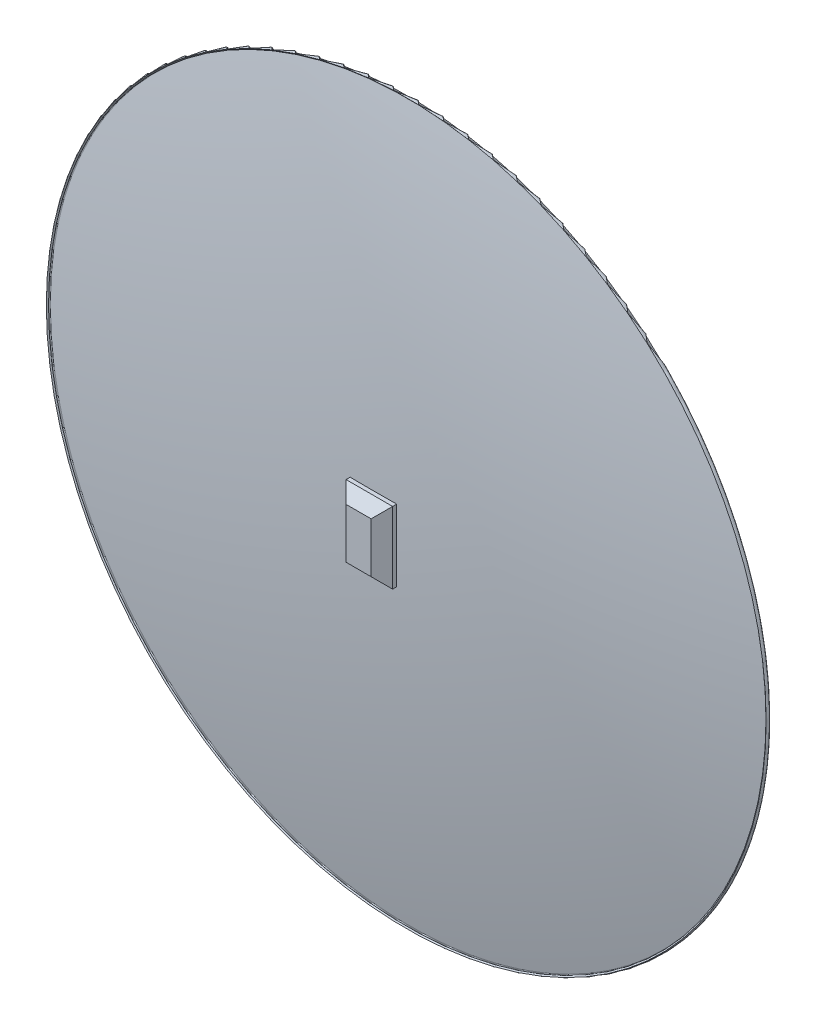
ISO-10303-21;
HEADER;
FILE_DESCRIPTION(('STEP AP214'),'2;1');
FILE_NAME('part.step','',(''),(''),'','','');
FILE_SCHEMA(('AUTOMOTIVE_DESIGN { 1 0 10303 214 1 1 1 1 }'));
ENDSEC;
DATA;
#1=APPLICATION_CONTEXT('core data for automotive mechanical design processes');
#2=APPLICATION_PROTOCOL_DEFINITION('international standard','automotive_design',2000,#1);
#3=PRODUCT_CONTEXT('',#1,'mechanical');
#4=PRODUCT('Part','Part','',(#3));
#5=PRODUCT_RELATED_PRODUCT_CATEGORY('part','',(#4));
#6=PRODUCT_DEFINITION_FORMATION('','',#4);
#7=PRODUCT_DEFINITION_CONTEXT('part definition',#1,'design');
#8=PRODUCT_DEFINITION('design','',#6,#7);
#9=PRODUCT_DEFINITION_SHAPE('','',#8);
#10=(LENGTH_UNIT() NAMED_UNIT(*) SI_UNIT(.MILLI.,.METRE.));
#11=(NAMED_UNIT(*) PLANE_ANGLE_UNIT() SI_UNIT($,.RADIAN.));
#12=(NAMED_UNIT(*) SI_UNIT($,.STERADIAN.) SOLID_ANGLE_UNIT());
#13=UNCERTAINTY_MEASURE_WITH_UNIT(LENGTH_MEASURE(1.E-05),#10,'distance_accuracy_value','');
#14=(GEOMETRIC_REPRESENTATION_CONTEXT(3) GLOBAL_UNCERTAINTY_ASSIGNED_CONTEXT((#13)) GLOBAL_UNIT_ASSIGNED_CONTEXT((#10,
#11,#12)) REPRESENTATION_CONTEXT('',''));
#15=CARTESIAN_POINT('',(0.,0.,0.));
#16=DIRECTION('',(0.,0.,1.));
#17=DIRECTION('',(1.,0.,0.));
#18=AXIS2_PLACEMENT_3D('',#15,#16,#17);
#19=CARTESIAN_POINT('',(-32.5,-50.,-2525.001));
#20=DIRECTION('',(0.,-1.,0.));
#21=DIRECTION('',(0.,0.,-1.));
#22=AXIS2_PLACEMENT_3D('',#19,#20,#21);
#23=PLANE('',#22);
#24=CARTESIAN_POINT('',(0.,-50.,2536.5));
#25=DIRECTION('',(0.,-1.,0.));
#26=DIRECTION('',(0.,0.,-1.));
#27=AXIS2_PLACEMENT_3D('',#24,#25,#26);
#28=CIRCLE('',#27,10.);
#29=CARTESIAN_POINT('',(0.324703671533918,-50.,2526.50527301395));
#30=VERTEX_POINT('',#29);
#31=CARTESIAN_POINT('',(8.93028554974581,-50.,2532.));
#32=VERTEX_POINT('',#31);
#33=EDGE_CURVE('E67',#30,#32,#28,.T.);
#34=ORIENTED_EDGE('',*,*,#33,.F.);
#35=CARTESIAN_POINT('',(0.,-50.,0.));
#36=DIRECTION('',(0.,-1.,0.));
#37=DIRECTION('',(0.,0.,-1.));
#38=AXIS2_PLACEMENT_3D('',#35,#36,#37);
#39=CIRCLE('',#38,2526.50529387928);
#40=CARTESIAN_POINT('',(32.5,-50.,2526.29625143212));
#41=VERTEX_POINT('',#40);
#42=EDGE_CURVE('E133',#41,#30,#39,.T.);
#43=ORIENTED_EDGE('',*,*,#42,.F.);
#44=DIRECTION('',(0.,0.,1.));
#45=VECTOR('',#44,1.);
#46=CARTESIAN_POINT('',(32.5,-50.,-2525.001));
#47=LINE('',#46,#45);
#48=CARTESIAN_POINT('',(32.5,-50.,2532.));
#49=VERTEX_POINT('',#48);
#50=EDGE_CURVE('E196',#41,#49,#47,.T.);
#51=ORIENTED_EDGE('',*,*,#50,.T.);
#52=DIRECTION('',(-1.,0.,0.));
#53=VECTOR('',#52,1.);
#54=CARTESIAN_POINT('',(-32.5,-50.,2532.));
#55=LINE('',#54,#53);
#56=EDGE_CURVE('E136',#49,#32,#55,.T.);
#57=ORIENTED_EDGE('',*,*,#56,.T.);
#58=EDGE_LOOP('',(#34,#43,#51,#57));
#59=FACE_BOUND('',#58,.T.);
#60=ADVANCED_FACE('F49',(#59),#23,.T.);
#61=CARTESIAN_POINT('',(0.,0.,2478.01573342677));
#62=DIRECTION('',(0.,0.,-1.));
#63=DIRECTION('',(-1.,0.,0.));
#64=AXIS2_PLACEMENT_3D('',#61,#62,#63);
#65=TOROIDAL_SURFACE('',#64,500.609239076115,1.07665733437962);
#66=CARTESIAN_POINT('',(0.,0.,2479.06491807163));
#67=DIRECTION('',(0.,0.,-1.));
#68=DIRECTION('',(-1.,0.,0.));
#69=AXIS2_PLACEMENT_3D('',#66,#67,#68);
#70=CIRCLE('',#69,500.850905368059);
#71=CARTESIAN_POINT('',(-500.850905368059,0.,2479.06491807163));
#72=VERTEX_POINT('',#71);
#73=EDGE_CURVE('E144',#72,#72,#70,.T.);
#74=ORIENTED_EDGE('',*,*,#73,.F.);
#75=EDGE_LOOP('',(#74));
#76=FACE_BOUND('',#75,.T.);
#77=CARTESIAN_POINT('',(0.,0.,2476.96039603961));
#78=DIRECTION('',(0.,0.,-1.));
#79=DIRECTION('',(-1.,0.,0.));
#80=AXIS2_PLACEMENT_3D('',#77,#78,#79);
#81=CIRCLE('',#80,500.396039603959);
#82=CARTESIAN_POINT('',(-500.396039603959,0.,2476.96039603961));
#83=VERTEX_POINT('',#82);
#84=EDGE_CURVE('E164',#83,#83,#81,.T.);
#85=ORIENTED_EDGE('',*,*,#84,.T.);
#86=EDGE_LOOP('',(#85));
#87=FACE_BOUND('',#86,.T.);
#88=ADVANCED_FACE('F257',(#76,#87),#65,.F.);
#89=CARTESIAN_POINT('',(0.,0.,0.));
#90=DIRECTION('',(0.,0.,-1.));
#91=DIRECTION('',(0.,1.,0.));
#92=AXIS2_PLACEMENT_3D('',#89,#90,#91);
#93=SPHERICAL_SURFACE('',#92,2527.);
#94=CARTESIAN_POINT('',(0.,50.,0.));
#95=DIRECTION('',(0.,1.,0.));
#96=DIRECTION('',(0.,0.,1.));
#97=AXIS2_PLACEMENT_3D('',#94,#95,#96);
#98=CIRCLE('',#97,2526.50529387928);
#99=CARTESIAN_POINT('',(-32.5,50.,2526.29625143212));
#100=VERTEX_POINT('',#99);
#101=CARTESIAN_POINT('',(32.5,50.,2526.29625143212));
#102=VERTEX_POINT('',#101);
#103=EDGE_CURVE('E205',#100,#102,#98,.T.);
#104=ORIENTED_EDGE('',*,*,#103,.T.);
#105=CARTESIAN_POINT('',(32.5,0.,0.));
#106=DIRECTION('',(1.,0.,0.));
#107=DIRECTION('',(0.,0.,-1.));
#108=AXIS2_PLACEMENT_3D('',#105,#106,#107);
#109=CIRCLE('',#108,2526.79099848009);
#110=EDGE_CURVE('E143',#102,#41,#109,.T.);
#111=ORIENTED_EDGE('',*,*,#110,.T.);
#112=ORIENTED_EDGE('',*,*,#42,.T.);
#113=CARTESIAN_POINT('',(0.,-50.,2536.5));
#114=DIRECTION('',(0.,-1.,0.));
#115=DIRECTION('',(-0.0324703671533932,0.,-0.999472698605081));
#116=AXIS2_PLACEMENT_3D('',#113,#114,#115);
#117=CIRCLE('',#116,9.99999999999994);
#118=CARTESIAN_POINT('',(-0.324703671533918,-50.,2526.50527301395));
#119=VERTEX_POINT('',#118);
#120=EDGE_CURVE('E116',#119,#30,#117,.T.);
#121=ORIENTED_EDGE('',*,*,#120,.F.);
#122=CARTESIAN_POINT('',(-32.5,-50.,2526.29625143212));
#123=VERTEX_POINT('',#122);
#124=EDGE_CURVE('E54',#119,#123,#39,.T.);
#125=ORIENTED_EDGE('',*,*,#124,.T.);
#126=CARTESIAN_POINT('',(-32.5,0.,0.));
#127=DIRECTION('',(-1.,0.,0.));
#128=DIRECTION('',(0.,0.,1.));
#129=AXIS2_PLACEMENT_3D('',#126,#127,#128);
#130=CIRCLE('',#129,2526.79099848009);
#131=EDGE_CURVE('E146',#123,#100,#130,.T.);
#132=ORIENTED_EDGE('',*,*,#131,.T.);
#133=EDGE_LOOP('',(#104,#111,#112,#121,#125,#132));
#134=FACE_BOUND('',#133,.T.);
#135=ORIENTED_EDGE('',*,*,#84,.F.);
#136=EDGE_LOOP('',(#135));
#137=FACE_BOUND('',#136,.T.);
#138=ADVANCED_FACE('F140',(#134,#137),#93,.T.);
#139=CARTESIAN_POINT('',(0.,0.,0.));
#140=DIRECTION('',(0.,0.,-1.));
#141=DIRECTION('',(0.,-1.,0.));
#142=AXIS2_PLACEMENT_3D('',#139,#140,#141);
#143=SPHERICAL_SURFACE('',#142,2525.);
#144=CARTESIAN_POINT('',(0.,0.,2475.));
#145=DIRECTION('',(0.,0.,-1.));
#146=DIRECTION('',(-1.,0.,0.));
#147=AXIS2_PLACEMENT_3D('',#144,#145,#146);
#148=CIRCLE('',#147,499.999999999998);
#149=CARTESIAN_POINT('',(-499.999999999998,0.,2475.));
#150=VERTEX_POINT('',#149);
#151=EDGE_CURVE('E161',#150,#150,#148,.T.);
#152=ORIENTED_EDGE('',*,*,#151,.T.);
#153=EDGE_LOOP('',(#152));
#154=FACE_BOUND('',#153,.T.);
#155=ADVANCED_FACE('F250',(#154),#143,.F.);
#156=CARTESIAN_POINT('',(0.,0.,2478.01573342677));
#157=DIRECTION('',(0.,0.,-1.));
#158=DIRECTION('',(-1.,0.,0.));
#159=AXIS2_PLACEMENT_3D('',#156,#157,#158);
#160=TOROIDAL_SURFACE('',#159,500.609239076115,3.07665733437934);
#161=ORIENTED_EDGE('',*,*,#151,.F.);
#162=EDGE_LOOP('',(#161));
#163=FACE_BOUND('',#162,.T.);
#164=CARTESIAN_POINT('',(0.,0.,2480.4472630085));
#165=DIRECTION('',(0.,0.,-1.));
#166=DIRECTION('',(-1.,0.,0.));
#167=AXIS2_PLACEMENT_3D('',#164,#165,#166);
#168=CIRCLE('',#167,502.494307840478);
#169=CARTESIAN_POINT('',(-502.494307840478,0.,2480.4472630085));
#170=VERTEX_POINT('',#169);
#171=EDGE_CURVE('E158',#170,#170,#168,.T.);
#172=ORIENTED_EDGE('',*,*,#171,.T.);
#173=EDGE_LOOP('',(#172));
#174=FACE_BOUND('',#173,.T.);
#175=ADVANCED_FACE('F246',(#163,#174),#160,.T.);
#176=CARTESIAN_POINT('',(0.,0.,2479.06491807163));
#177=DIRECTION('',(0.,0.,1.));
#178=DIRECTION('',(1.,0.,0.));
#179=AXIS2_PLACEMENT_3D('',#176,#177,#178);
#180=CONICAL_SURFACE('',#179,500.850905368059,0.871463722197309);
#181=ORIENTED_EDGE('',*,*,#171,.F.);
#182=EDGE_LOOP('',(#181));
#183=FACE_BOUND('',#182,.T.);
#184=ORIENTED_EDGE('',*,*,#73,.T.);
#185=EDGE_LOOP('',(#184));
#186=FACE_BOUND('',#185,.T.);
#187=ADVANCED_FACE('F243',(#183,#186),#180,.F.);
#188=CARTESIAN_POINT('',(32.5,-50.,-2525.001));
#189=DIRECTION('',(1.,0.,0.));
#190=DIRECTION('',(0.,0.,-1.));
#191=AXIS2_PLACEMENT_3D('',#188,#189,#190);
#192=PLANE('',#191);
#193=DIRECTION('',(0.,0.,1.));
#194=VECTOR('',#193,1.);
#195=CARTESIAN_POINT('',(32.5,50.,-2525.001));
#196=LINE('',#195,#194);
#197=CARTESIAN_POINT('',(32.5,50.,2532.));
#198=VERTEX_POINT('',#197);
#199=EDGE_CURVE('E191',#102,#198,#196,.T.);
#200=ORIENTED_EDGE('',*,*,#199,.T.);
#201=DIRECTION('',(0.,-1.,0.));
#202=VECTOR('',#201,1.);
#203=CARTESIAN_POINT('',(32.5,-50.,2532.));
#204=LINE('',#203,#202);
#205=EDGE_CURVE('E60',#198,#49,#204,.T.);
#206=ORIENTED_EDGE('',*,*,#205,.T.);
#207=ORIENTED_EDGE('',*,*,#50,.F.);
#208=ORIENTED_EDGE('',*,*,#110,.F.);
#209=EDGE_LOOP('',(#200,#206,#207,#208));
#210=FACE_BOUND('',#209,.T.);
#211=ADVANCED_FACE('F239',(#210),#192,.T.);
#212=CARTESIAN_POINT('',(-8.9302855497458,-50.,2532.));
#213=VERTEX_POINT('',#212);
#214=EDGE_CURVE('E121',#213,#119,#28,.T.);
#215=ORIENTED_EDGE('',*,*,#214,.F.);
#216=CARTESIAN_POINT('',(-32.5,-50.,2532.));
#217=VERTEX_POINT('',#216);
#218=EDGE_CURVE('E176',#213,#217,#55,.T.);
#219=ORIENTED_EDGE('',*,*,#218,.T.);
#220=DIRECTION('',(0.,0.,1.));
#221=VECTOR('',#220,1.);
#222=CARTESIAN_POINT('',(-32.5,-50.,-2525.001));
#223=LINE('',#222,#221);
#224=EDGE_CURVE('E200',#123,#217,#223,.T.);
#225=ORIENTED_EDGE('',*,*,#224,.F.);
#226=ORIENTED_EDGE('',*,*,#124,.F.);
#227=EDGE_LOOP('',(#215,#219,#225,#226));
#228=FACE_BOUND('',#227,.T.);
#229=ADVANCED_FACE('F236',(#228),#23,.T.);
#230=CARTESIAN_POINT('',(-32.5,-50.,-2525.001));
#231=DIRECTION('',(-1.,0.,0.));
#232=DIRECTION('',(0.,0.,1.));
#233=AXIS2_PLACEMENT_3D('',#230,#231,#232);
#234=PLANE('',#233);
#235=ORIENTED_EDGE('',*,*,#224,.T.);
#236=DIRECTION('',(0.,1.,0.));
#237=VECTOR('',#236,1.);
#238=CARTESIAN_POINT('',(-32.5,50.,2532.));
#239=LINE('',#238,#237);
#240=CARTESIAN_POINT('',(-32.5,50.,2532.));
#241=VERTEX_POINT('',#240);
#242=EDGE_CURVE('E178',#217,#241,#239,.T.);
#243=ORIENTED_EDGE('',*,*,#242,.T.);
#244=DIRECTION('',(0.,0.,1.));
#245=VECTOR('',#244,1.);
#246=CARTESIAN_POINT('',(-32.5,50.,-2525.001));
#247=LINE('',#246,#245);
#248=EDGE_CURVE('E203',#100,#241,#247,.T.);
#249=ORIENTED_EDGE('',*,*,#248,.F.);
#250=ORIENTED_EDGE('',*,*,#131,.F.);
#251=EDGE_LOOP('',(#235,#243,#249,#250));
#252=FACE_BOUND('',#251,.T.);
#253=ADVANCED_FACE('F233',(#252),#234,.T.);
#254=CARTESIAN_POINT('',(-32.5,50.,-2525.001));
#255=DIRECTION('',(0.,1.,0.));
#256=DIRECTION('',(0.,0.,1.));
#257=AXIS2_PLACEMENT_3D('',#254,#255,#256);
#258=PLANE('',#257);
#259=ORIENTED_EDGE('',*,*,#248,.T.);
#260=DIRECTION('',(1.,0.,0.));
#261=VECTOR('',#260,1.);
#262=CARTESIAN_POINT('',(32.5,50.,2532.));
#263=LINE('',#262,#261);
#264=EDGE_CURVE('E75',#241,#198,#263,.T.);
#265=ORIENTED_EDGE('',*,*,#264,.T.);
#266=ORIENTED_EDGE('',*,*,#199,.F.);
#267=ORIENTED_EDGE('',*,*,#103,.F.);
#268=EDGE_LOOP('',(#259,#265,#266,#267));
#269=FACE_BOUND('',#268,.T.);
#270=ADVANCED_FACE('F229',(#269),#258,.T.);
#271=CARTESIAN_POINT('',(0.,0.,2547.));
#272=DIRECTION('',(0.,0.,-1.));
#273=DIRECTION('',(-1.,0.,0.));
#274=AXIS2_PLACEMENT_3D('',#271,#272,#273);
#275=PLANE('',#274);
#276=DIRECTION('',(0.,-1.,0.));
#277=VECTOR('',#276,1.);
#278=CARTESIAN_POINT('',(-17.4999999999999,-50.,2547.));
#279=LINE('',#278,#277);
#280=CARTESIAN_POINT('',(-17.4999999999999,34.9999999999999,2547.));
#281=VERTEX_POINT('',#280);
#282=CARTESIAN_POINT('',(-17.4999999999999,-34.9999999999999,2547.));
#283=VERTEX_POINT('',#282);
#284=EDGE_CURVE('E171',#281,#283,#279,.T.);
#285=ORIENTED_EDGE('',*,*,#284,.T.);
#286=DIRECTION('',(1.,0.,0.));
#287=VECTOR('',#286,1.);
#288=CARTESIAN_POINT('',(32.5,-34.9999999999999,2547.));
#289=LINE('',#288,#287);
#290=CARTESIAN_POINT('',(17.4999999999999,-34.9999999999999,2547.));
#291=VERTEX_POINT('',#290);
#292=EDGE_CURVE('E173',#283,#291,#289,.T.);
#293=ORIENTED_EDGE('',*,*,#292,.T.);
#294=DIRECTION('',(0.,1.,0.));
#295=VECTOR('',#294,1.);
#296=CARTESIAN_POINT('',(17.4999999999999,50.,2547.));
#297=LINE('',#296,#295);
#298=CARTESIAN_POINT('',(17.4999999999999,34.9999999999999,2547.));
#299=VERTEX_POINT('',#298);
#300=EDGE_CURVE('E167',#291,#299,#297,.T.);
#301=ORIENTED_EDGE('',*,*,#300,.T.);
#302=DIRECTION('',(-1.,0.,0.));
#303=VECTOR('',#302,1.);
#304=CARTESIAN_POINT('',(-32.5,34.9999999999999,2547.));
#305=LINE('',#304,#303);
#306=EDGE_CURVE('E169',#299,#281,#305,.T.);
#307=ORIENTED_EDGE('',*,*,#306,.T.);
#308=EDGE_LOOP('',(#285,#293,#301,#307));
#309=FACE_BOUND('',#308,.T.);
#310=ADVANCED_FACE('F226',(#309),#275,.F.);
#311=CARTESIAN_POINT('',(0.,34.9999999999999,2547.));
#312=DIRECTION('',(0.,0.707106781186548,0.707106781186548));
#313=DIRECTION('',(1.,0.,0.));
#314=AXIS2_PLACEMENT_3D('',#311,#312,#313);
#315=PLANE('',#314);
#316=DIRECTION('',(-0.577350269189626,-0.577350269189626,0.577350269189626));
#317=VECTOR('',#316,1.);
#318=CARTESIAN_POINT('',(5.83333333333326,23.3333333333332,2558.66666666667));
#319=LINE('',#318,#317);
#320=EDGE_CURVE('E186',#198,#299,#319,.T.);
#321=ORIENTED_EDGE('',*,*,#320,.F.);
#322=ORIENTED_EDGE('',*,*,#264,.F.);
#323=DIRECTION('',(0.577350269189626,-0.577350269189626,0.577350269189626));
#324=VECTOR('',#323,1.);
#325=CARTESIAN_POINT('',(-11.6666666666666,29.1666666666666,2552.83333333333));
#326=LINE('',#325,#324);
#327=EDGE_CURVE('E189',#281,#241,#326,.F.);
#328=ORIENTED_EDGE('',*,*,#327,.F.);
#329=ORIENTED_EDGE('',*,*,#306,.F.);
#330=EDGE_LOOP('',(#321,#322,#328,#329));
#331=FACE_BOUND('',#330,.T.);
#332=ADVANCED_FACE('F52',(#331),#315,.T.);
#333=CARTESIAN_POINT('',(-17.4999999999999,0.,2547.));
#334=DIRECTION('',(-0.707106781186548,0.,0.707106781186548));
#335=DIRECTION('',(0.,1.,0.));
#336=AXIS2_PLACEMENT_3D('',#333,#334,#335);
#337=PLANE('',#336);
#338=ORIENTED_EDGE('',*,*,#327,.T.);
#339=ORIENTED_EDGE('',*,*,#242,.F.);
#340=DIRECTION('',(0.577350269189626,0.577350269189626,0.577350269189626));
#341=VECTOR('',#340,1.);
#342=CARTESIAN_POINT('',(-5.83333333333324,-23.3333333333333,2558.66666666667));
#343=LINE('',#342,#341);
#344=EDGE_CURVE('E183',#283,#217,#343,.F.);
#345=ORIENTED_EDGE('',*,*,#344,.F.);
#346=ORIENTED_EDGE('',*,*,#284,.F.);
#347=EDGE_LOOP('',(#338,#339,#345,#346));
#348=FACE_BOUND('',#347,.T.);
#349=ADVANCED_FACE('F273',(#348),#337,.T.);
#350=CARTESIAN_POINT('',(17.4999999999999,0.,2547.));
#351=DIRECTION('',(0.707106781186548,0.,0.707106781186548));
#352=DIRECTION('',(0.,-1.,0.));
#353=AXIS2_PLACEMENT_3D('',#350,#351,#352);
#354=PLANE('',#353);
#355=ORIENTED_EDGE('',*,*,#320,.T.);
#356=ORIENTED_EDGE('',*,*,#300,.F.);
#357=DIRECTION('',(0.577350269189626,-0.577350269189626,-0.577350269189626));
#358=VECTOR('',#357,1.);
#359=CARTESIAN_POINT('',(5.83333333333325,-23.3333333333333,2558.66666666667));
#360=LINE('',#359,#358);
#361=EDGE_CURVE('E126',#49,#291,#360,.F.);
#362=ORIENTED_EDGE('',*,*,#361,.F.);
#363=ORIENTED_EDGE('',*,*,#205,.F.);
#364=EDGE_LOOP('',(#355,#356,#362,#363));
#365=FACE_BOUND('',#364,.T.);
#366=ADVANCED_FACE('F267',(#365),#354,.T.);
#367=CARTESIAN_POINT('',(0.,-34.9999999999999,2547.));
#368=DIRECTION('',(0.,-0.707106781186548,0.707106781186548));
#369=DIRECTION('',(-1.,0.,0.));
#370=AXIS2_PLACEMENT_3D('',#367,#368,#369);
#371=PLANE('',#370);
#372=CARTESIAN_POINT('',(0.,-45.4999999999998,2536.5));
#373=DIRECTION('',(0.,-0.707106781186548,0.707106781186548));
#374=DIRECTION('',(0.,-0.707106781186548,-0.707106781186548));
#375=AXIS2_PLACEMENT_3D('',#372,#373,#374);
#376=ELLIPSE('',#375,14.142135623731,10.);
#377=EDGE_CURVE('E13',#32,#213,#376,.T.);
#378=ORIENTED_EDGE('',*,*,#377,.F.);
#379=ORIENTED_EDGE('',*,*,#56,.F.);
#380=ORIENTED_EDGE('',*,*,#361,.T.);
#381=ORIENTED_EDGE('',*,*,#292,.F.);
#382=ORIENTED_EDGE('',*,*,#344,.T.);
#383=ORIENTED_EDGE('',*,*,#218,.F.);
#384=EDGE_LOOP('',(#378,#379,#380,#381,#382,#383));
#385=FACE_BOUND('',#384,.T.);
#386=ADVANCED_FACE('F225',(#385),#371,.T.);
#387=CARTESIAN_POINT('',(0.,-30.,2536.5));
#388=DIRECTION('',(0.,-1.,0.));
#389=DIRECTION('',(0.,0.,-1.));
#390=AXIS2_PLACEMENT_3D('',#387,#388,#389);
#391=CYLINDRICAL_SURFACE('',#390,10.);
#392=ORIENTED_EDGE('',*,*,#377,.T.);
#393=ORIENTED_EDGE('',*,*,#214,.T.);
#394=ORIENTED_EDGE('',*,*,#120,.T.);
#395=ORIENTED_EDGE('',*,*,#33,.T.);
#396=EDGE_LOOP('',(#392,#393,#394,#395));
#397=FACE_BOUND('',#396,.T.);
#398=CARTESIAN_POINT('',(0.,-30.,2536.5));
#399=DIRECTION('',(0.,-1.,0.));
#400=DIRECTION('',(0.,0.,-1.));
#401=AXIS2_PLACEMENT_3D('',#398,#399,#400);
#402=CIRCLE('',#401,10.);
#403=CARTESIAN_POINT('',(0.,-30.,2526.5));
#404=VERTEX_POINT('',#403);
#405=EDGE_CURVE('E127',#404,#404,#402,.T.);
#406=ORIENTED_EDGE('',*,*,#405,.F.);
#407=EDGE_LOOP('',(#406));
#408=FACE_BOUND('',#407,.T.);
#409=ADVANCED_FACE('F118',(#397,#408),#391,.F.);
#410=CARTESIAN_POINT('',(0.,-30.,2536.5));
#411=DIRECTION('',(0.,-1.,0.));
#412=DIRECTION('',(0.,0.,-1.));
#413=AXIS2_PLACEMENT_3D('',#410,#411,#412);
#414=PLANE('',#413);
#415=ORIENTED_EDGE('',*,*,#405,.T.);
#416=EDGE_LOOP('',(#415));
#417=FACE_BOUND('',#416,.T.);
#418=ADVANCED_FACE('F224',(#417),#414,.T.);
#419=CLOSED_SHELL('',(#60,#88,#138,#155,#175,#187,#211,#229,#253,#270,#310,#332,#349,#366,#386,
#409,#418));
#420=MANIFOLD_SOLID_BREP('B2',#419);
#421=ADVANCED_BREP_SHAPE_REPRESENTATION('',(#18,#420),#14);
#422=SHAPE_DEFINITION_REPRESENTATION(#9,#421);
ENDSEC;
END-ISO-10303-21;
